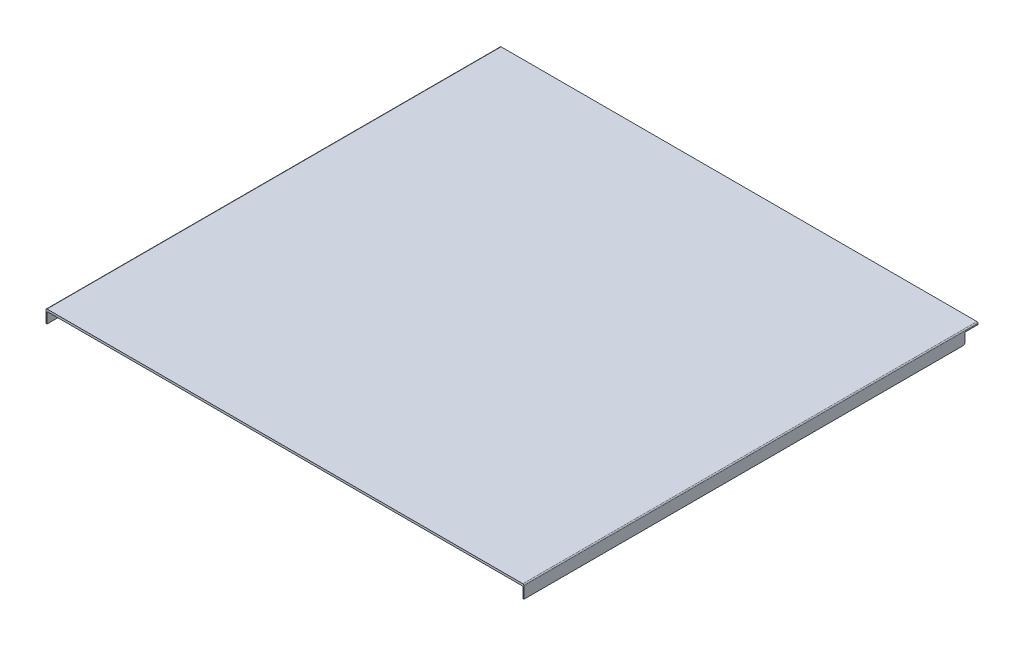
ISO-10303-21;
HEADER;
FILE_DESCRIPTION(('STEP AP214'),'2;1');
FILE_NAME('part.step','',(''),(''),'','','');
FILE_SCHEMA(('AUTOMOTIVE_DESIGN { 1 0 10303 214 1 1 1 1 }'));
ENDSEC;
DATA;
#1=APPLICATION_CONTEXT('core data for automotive mechanical design processes');
#2=APPLICATION_PROTOCOL_DEFINITION('international standard','automotive_design',2000,#1);
#3=PRODUCT_CONTEXT('',#1,'mechanical');
#4=PRODUCT('Part','Part','',(#3));
#5=PRODUCT_RELATED_PRODUCT_CATEGORY('part','',(#4));
#6=PRODUCT_DEFINITION_FORMATION('','',#4);
#7=PRODUCT_DEFINITION_CONTEXT('part definition',#1,'design');
#8=PRODUCT_DEFINITION('design','',#6,#7);
#9=PRODUCT_DEFINITION_SHAPE('','',#8);
#10=(LENGTH_UNIT() NAMED_UNIT(*) SI_UNIT(.MILLI.,.METRE.));
#11=(NAMED_UNIT(*) PLANE_ANGLE_UNIT() SI_UNIT($,.RADIAN.));
#12=(NAMED_UNIT(*) SI_UNIT($,.STERADIAN.) SOLID_ANGLE_UNIT());
#13=UNCERTAINTY_MEASURE_WITH_UNIT(LENGTH_MEASURE(1.E-05),#10,'distance_accuracy_value','');
#14=(GEOMETRIC_REPRESENTATION_CONTEXT(3) GLOBAL_UNCERTAINTY_ASSIGNED_CONTEXT((#13)) GLOBAL_UNIT_ASSIGNED_CONTEXT((#10,
#11,#12)) REPRESENTATION_CONTEXT('',''));
#15=CARTESIAN_POINT('',(0.,0.,0.));
#16=DIRECTION('',(0.,0.,1.));
#17=DIRECTION('',(1.,0.,0.));
#18=AXIS2_PLACEMENT_3D('',#15,#16,#17);
#19=CARTESIAN_POINT('',(0.,0.,0.));
#20=DIRECTION('',(0.,-1.,0.));
#21=DIRECTION('',(0.,0.,-1.));
#22=AXIS2_PLACEMENT_3D('',#19,#20,#21);
#23=PLANE('',#22);
#24=DIRECTION('',(1.,0.,0.));
#25=VECTOR('',#24,1.);
#26=CARTESIAN_POINT('',(-221.,0.,210.));
#27=LINE('',#26,#25);
#28=CARTESIAN_POINT('',(-219.5,0.,210.));
#29=VERTEX_POINT('',#28);
#30=CARTESIAN_POINT('',(219.5,0.,210.));
#31=VERTEX_POINT('',#30);
#32=EDGE_CURVE('E201',#29,#31,#27,.T.);
#33=ORIENTED_EDGE('',*,*,#32,.F.);
#34=DIRECTION('',(0.,0.,1.));
#35=VECTOR('',#34,1.);
#36=CARTESIAN_POINT('',(-219.5,0.,0.));
#37=LINE('',#36,#35);
#38=CARTESIAN_POINT('',(-219.5,0.,-198.5));
#39=VERTEX_POINT('',#38);
#40=EDGE_CURVE('E273',#29,#39,#37,.F.);
#41=ORIENTED_EDGE('',*,*,#40,.T.);
#42=DIRECTION('',(1.,0.,0.));
#43=VECTOR('',#42,1.);
#44=CARTESIAN_POINT('',(0.,0.,-198.5));
#45=LINE('',#44,#43);
#46=CARTESIAN_POINT('',(-221.,0.,-198.5));
#47=VERTEX_POINT('',#46);
#48=EDGE_CURVE('E53',#39,#47,#45,.F.);
#49=ORIENTED_EDGE('',*,*,#48,.T.);
#50=DIRECTION('',(0.,0.,1.));
#51=VECTOR('',#50,1.);
#52=CARTESIAN_POINT('',(-221.,0.,210.));
#53=LINE('',#52,#51);
#54=CARTESIAN_POINT('',(-221.,0.,-210.));
#55=VERTEX_POINT('',#54);
#56=EDGE_CURVE('E210',#55,#47,#53,.T.);
#57=ORIENTED_EDGE('',*,*,#56,.F.);
#58=DIRECTION('',(-1.,0.,0.));
#59=VECTOR('',#58,1.);
#60=CARTESIAN_POINT('',(-221.,0.,-210.));
#61=LINE('',#60,#59);
#62=CARTESIAN_POINT('',(221.,0.,-210.));
#63=VERTEX_POINT('',#62);
#64=EDGE_CURVE('E207',#63,#55,#61,.T.);
#65=ORIENTED_EDGE('',*,*,#64,.F.);
#66=DIRECTION('',(0.,0.,-1.));
#67=VECTOR('',#66,1.);
#68=CARTESIAN_POINT('',(221.,0.,210.));
#69=LINE('',#68,#67);
#70=CARTESIAN_POINT('',(221.,0.,-198.5));
#71=VERTEX_POINT('',#70);
#72=EDGE_CURVE('E196',#71,#63,#69,.T.);
#73=ORIENTED_EDGE('',*,*,#72,.F.);
#74=DIRECTION('',(1.,0.,0.));
#75=VECTOR('',#74,1.);
#76=CARTESIAN_POINT('',(0.,0.,-198.5));
#77=LINE('',#76,#75);
#78=CARTESIAN_POINT('',(219.5,0.,-198.5));
#79=VERTEX_POINT('',#78);
#80=EDGE_CURVE('E241',#71,#79,#77,.F.);
#81=ORIENTED_EDGE('',*,*,#80,.T.);
#82=DIRECTION('',(0.,0.,-1.));
#83=VECTOR('',#82,1.);
#84=CARTESIAN_POINT('',(219.5,0.,0.));
#85=LINE('',#84,#83);
#86=EDGE_CURVE('E271',#79,#31,#85,.F.);
#87=ORIENTED_EDGE('',*,*,#86,.T.);
#88=EDGE_LOOP('',(#33,#41,#49,#57,#65,#73,#81,#87));
#89=FACE_BOUND('',#88,.T.);
#90=ADVANCED_FACE('F32',(#89),#23,.T.);
#91=CARTESIAN_POINT('',(221.,2.,210.));
#92=DIRECTION('',(-1.,0.,0.));
#93=DIRECTION('',(0.,0.,1.));
#94=AXIS2_PLACEMENT_3D('',#91,#92,#93);
#95=PLANE('',#94);
#96=DIRECTION('',(0.,-1.,0.));
#97=VECTOR('',#96,1.);
#98=CARTESIAN_POINT('',(221.,2.,-210.));
#99=LINE('',#98,#97);
#100=CARTESIAN_POINT('',(221.,1.,-210.));
#101=VERTEX_POINT('',#100);
#102=EDGE_CURVE('E219',#101,#63,#99,.T.);
#103=ORIENTED_EDGE('',*,*,#102,.F.);
#104=DIRECTION('',(0.,0.,-1.));
#105=VECTOR('',#104,1.);
#106=CARTESIAN_POINT('',(221.,1.,210.));
#107=LINE('',#106,#105);
#108=CARTESIAN_POINT('',(221.,1.,210.));
#109=VERTEX_POINT('',#108);
#110=EDGE_CURVE('E260',#101,#109,#107,.F.);
#111=ORIENTED_EDGE('',*,*,#110,.T.);
#112=DIRECTION('',(0.,-1.,0.));
#113=VECTOR('',#112,1.);
#114=CARTESIAN_POINT('',(221.,2.,210.));
#115=LINE('',#114,#113);
#116=CARTESIAN_POINT('',(221.,-10.,210.));
#117=VERTEX_POINT('',#116);
#118=EDGE_CURVE('E204',#109,#117,#115,.T.);
#119=ORIENTED_EDGE('',*,*,#118,.T.);
#120=DIRECTION('',(0.,0.,1.));
#121=VECTOR('',#120,1.);
#122=CARTESIAN_POINT('',(221.,-10.,210.));
#123=LINE('',#122,#121);
#124=CARTESIAN_POINT('',(221.,-10.,-196.));
#125=VERTEX_POINT('',#124);
#126=EDGE_CURVE('E162',#125,#117,#123,.T.);
#127=ORIENTED_EDGE('',*,*,#126,.F.);
#128=CARTESIAN_POINT('',(221.,-8.,-196.));
#129=DIRECTION('',(-1.,0.,0.));
#130=DIRECTION('',(0.,0.,1.));
#131=AXIS2_PLACEMENT_3D('',#128,#129,#130);
#132=CIRCLE('',#131,2.);
#133=CARTESIAN_POINT('',(221.,-8.,-198.));
#134=VERTEX_POINT('',#133);
#135=EDGE_CURVE('E223',#125,#134,#132,.F.);
#136=ORIENTED_EDGE('',*,*,#135,.T.);
#137=DIRECTION('',(0.,1.,0.));
#138=VECTOR('',#137,1.);
#139=CARTESIAN_POINT('',(221.,-10.,-198.));
#140=LINE('',#139,#138);
#141=CARTESIAN_POINT('',(221.,-0.5,-198.));
#142=VERTEX_POINT('',#141);
#143=EDGE_CURVE('E179',#134,#142,#140,.T.);
#144=ORIENTED_EDGE('',*,*,#143,.T.);
#145=CARTESIAN_POINT('',(221.,-0.5,-198.5));
#146=DIRECTION('',(-1.,0.,0.));
#147=DIRECTION('',(0.,0.,1.));
#148=AXIS2_PLACEMENT_3D('',#145,#146,#147);
#149=CIRCLE('',#148,0.5);
#150=EDGE_CURVE('E246',#142,#71,#149,.T.);
#151=ORIENTED_EDGE('',*,*,#150,.T.);
#152=ORIENTED_EDGE('',*,*,#72,.T.);
#153=EDGE_LOOP('',(#103,#111,#119,#127,#136,#144,#151,#152));
#154=FACE_BOUND('',#153,.T.);
#155=ADVANCED_FACE('F335',(#154),#95,.F.);
#156=CARTESIAN_POINT('',(-221.,2.,-210.));
#157=DIRECTION('',(0.,0.,1.));
#158=DIRECTION('',(1.,0.,0.));
#159=AXIS2_PLACEMENT_3D('',#156,#157,#158);
#160=PLANE('',#159);
#161=DIRECTION('',(-1.,0.,0.));
#162=VECTOR('',#161,1.);
#163=CARTESIAN_POINT('',(-221.,2.,-210.));
#164=LINE('',#163,#162);
#165=CARTESIAN_POINT('',(220.,2.,-210.));
#166=VERTEX_POINT('',#165);
#167=CARTESIAN_POINT('',(-220.,2.,-210.));
#168=VERTEX_POINT('',#167);
#169=EDGE_CURVE('E197',#166,#168,#164,.T.);
#170=ORIENTED_EDGE('',*,*,#169,.F.);
#171=CARTESIAN_POINT('',(220.,1.,-210.));
#172=DIRECTION('',(0.,0.,1.));
#173=DIRECTION('',(1.,0.,0.));
#174=AXIS2_PLACEMENT_3D('',#171,#172,#173);
#175=CIRCLE('',#174,1.);
#176=EDGE_CURVE('E258',#166,#101,#175,.F.);
#177=ORIENTED_EDGE('',*,*,#176,.T.);
#178=ORIENTED_EDGE('',*,*,#102,.T.);
#179=ORIENTED_EDGE('',*,*,#64,.T.);
#180=DIRECTION('',(0.,-1.,0.));
#181=VECTOR('',#180,1.);
#182=CARTESIAN_POINT('',(-221.,2.,-210.));
#183=LINE('',#182,#181);
#184=CARTESIAN_POINT('',(-221.,1.,-210.));
#185=VERTEX_POINT('',#184);
#186=EDGE_CURVE('E217',#185,#55,#183,.T.);
#187=ORIENTED_EDGE('',*,*,#186,.F.);
#188=CARTESIAN_POINT('',(-220.,1.,-210.));
#189=DIRECTION('',(0.,0.,1.));
#190=DIRECTION('',(1.,0.,0.));
#191=AXIS2_PLACEMENT_3D('',#188,#189,#190);
#192=CIRCLE('',#191,1.);
#193=EDGE_CURVE('E256',#185,#168,#192,.F.);
#194=ORIENTED_EDGE('',*,*,#193,.T.);
#195=EDGE_LOOP('',(#170,#177,#178,#179,#187,#194));
#196=FACE_BOUND('',#195,.T.);
#197=ADVANCED_FACE('F325',(#196),#160,.F.);
#198=CARTESIAN_POINT('',(-221.,2.,210.));
#199=DIRECTION('',(1.,0.,0.));
#200=DIRECTION('',(0.,0.,-1.));
#201=AXIS2_PLACEMENT_3D('',#198,#199,#200);
#202=PLANE('',#201);
#203=DIRECTION('',(0.,-1.,0.));
#204=VECTOR('',#203,1.);
#205=CARTESIAN_POINT('',(-221.,2.,210.));
#206=LINE('',#205,#204);
#207=CARTESIAN_POINT('',(-221.,1.,210.));
#208=VERTEX_POINT('',#207);
#209=CARTESIAN_POINT('',(-221.,-10.,210.));
#210=VERTEX_POINT('',#209);
#211=EDGE_CURVE('E215',#208,#210,#206,.T.);
#212=ORIENTED_EDGE('',*,*,#211,.F.);
#213=DIRECTION('',(0.,0.,1.));
#214=VECTOR('',#213,1.);
#215=CARTESIAN_POINT('',(-221.,1.,210.));
#216=LINE('',#215,#214);
#217=EDGE_CURVE('E266',#208,#185,#216,.F.);
#218=ORIENTED_EDGE('',*,*,#217,.T.);
#219=ORIENTED_EDGE('',*,*,#186,.T.);
#220=ORIENTED_EDGE('',*,*,#56,.T.);
#221=CARTESIAN_POINT('',(-221.,-0.5,-198.5));
#222=DIRECTION('',(1.,0.,0.));
#223=DIRECTION('',(0.,0.,-1.));
#224=AXIS2_PLACEMENT_3D('',#221,#222,#223);
#225=CIRCLE('',#224,0.5);
#226=CARTESIAN_POINT('',(-221.,-0.5,-198.));
#227=VERTEX_POINT('',#226);
#228=EDGE_CURVE('E248',#47,#227,#225,.T.);
#229=ORIENTED_EDGE('',*,*,#228,.T.);
#230=DIRECTION('',(0.,1.,0.));
#231=VECTOR('',#230,1.);
#232=CARTESIAN_POINT('',(-221.,-10.,-198.));
#233=LINE('',#232,#231);
#234=CARTESIAN_POINT('',(-221.,-8.,-198.));
#235=VERTEX_POINT('',#234);
#236=EDGE_CURVE('E193',#235,#227,#233,.T.);
#237=ORIENTED_EDGE('',*,*,#236,.F.);
#238=CARTESIAN_POINT('',(-221.,-8.,-196.));
#239=DIRECTION('',(1.,0.,0.));
#240=DIRECTION('',(0.,0.,-1.));
#241=AXIS2_PLACEMENT_3D('',#238,#239,#240);
#242=CIRCLE('',#241,2.);
#243=CARTESIAN_POINT('',(-221.,-10.,-196.));
#244=VERTEX_POINT('',#243);
#245=EDGE_CURVE('E235',#235,#244,#242,.F.);
#246=ORIENTED_EDGE('',*,*,#245,.T.);
#247=DIRECTION('',(0.,0.,-1.));
#248=VECTOR('',#247,1.);
#249=CARTESIAN_POINT('',(-221.,-10.,210.));
#250=LINE('',#249,#248);
#251=EDGE_CURVE('E172',#210,#244,#250,.T.);
#252=ORIENTED_EDGE('',*,*,#251,.F.);
#253=EDGE_LOOP('',(#212,#218,#219,#220,#229,#237,#246,#252));
#254=FACE_BOUND('',#253,.T.);
#255=ADVANCED_FACE('F313',(#254),#202,.F.);
#256=CARTESIAN_POINT('',(-221.,2.,210.));
#257=DIRECTION('',(0.,0.,-1.));
#258=DIRECTION('',(-1.,0.,0.));
#259=AXIS2_PLACEMENT_3D('',#256,#257,#258);
#260=PLANE('',#259);
#261=ORIENTED_EDGE('',*,*,#118,.F.);
#262=CARTESIAN_POINT('',(220.,1.,210.));
#263=DIRECTION('',(0.,0.,-1.));
#264=DIRECTION('',(-1.,0.,0.));
#265=AXIS2_PLACEMENT_3D('',#262,#263,#264);
#266=CIRCLE('',#265,1.);
#267=CARTESIAN_POINT('',(220.,2.,210.));
#268=VERTEX_POINT('',#267);
#269=EDGE_CURVE('E264',#109,#268,#266,.F.);
#270=ORIENTED_EDGE('',*,*,#269,.T.);
#271=DIRECTION('',(1.,0.,0.));
#272=VECTOR('',#271,1.);
#273=CARTESIAN_POINT('',(-221.,2.,210.));
#274=LINE('',#273,#272);
#275=CARTESIAN_POINT('',(-220.,2.,210.));
#276=VERTEX_POINT('',#275);
#277=EDGE_CURVE('E200',#276,#268,#274,.T.);
#278=ORIENTED_EDGE('',*,*,#277,.F.);
#279=CARTESIAN_POINT('',(-220.,1.,210.));
#280=DIRECTION('',(0.,0.,-1.));
#281=DIRECTION('',(-1.,0.,0.));
#282=AXIS2_PLACEMENT_3D('',#279,#280,#281);
#283=CIRCLE('',#282,1.);
#284=EDGE_CURVE('E262',#276,#208,#283,.F.);
#285=ORIENTED_EDGE('',*,*,#284,.T.);
#286=ORIENTED_EDGE('',*,*,#211,.T.);
#287=DIRECTION('',(-1.,0.,0.));
#288=VECTOR('',#287,1.);
#289=CARTESIAN_POINT('',(-221.,-10.,210.));
#290=LINE('',#289,#288);
#291=CARTESIAN_POINT('',(-220.,-10.,210.));
#292=VERTEX_POINT('',#291);
#293=EDGE_CURVE('E184',#292,#210,#290,.T.);
#294=ORIENTED_EDGE('',*,*,#293,.F.);
#295=DIRECTION('',(0.,1.,0.));
#296=VECTOR('',#295,1.);
#297=CARTESIAN_POINT('',(-220.,-10.,210.));
#298=LINE('',#297,#296);
#299=CARTESIAN_POINT('',(-220.,-0.5,210.));
#300=VERTEX_POINT('',#299);
#301=EDGE_CURVE('E187',#292,#300,#298,.T.);
#302=ORIENTED_EDGE('',*,*,#301,.T.);
#303=CARTESIAN_POINT('',(-219.5,-0.5,210.));
#304=DIRECTION('',(0.,0.,-1.));
#305=DIRECTION('',(-1.,0.,0.));
#306=AXIS2_PLACEMENT_3D('',#303,#304,#305);
#307=CIRCLE('',#306,0.5);
#308=EDGE_CURVE('E277',#300,#29,#307,.T.);
#309=ORIENTED_EDGE('',*,*,#308,.T.);
#310=ORIENTED_EDGE('',*,*,#32,.T.);
#311=CARTESIAN_POINT('',(219.5,-0.5,210.));
#312=DIRECTION('',(0.,0.,-1.));
#313=DIRECTION('',(-1.,0.,0.));
#314=AXIS2_PLACEMENT_3D('',#311,#312,#313);
#315=CIRCLE('',#314,0.5);
#316=CARTESIAN_POINT('',(220.,-0.5,210.));
#317=VERTEX_POINT('',#316);
#318=EDGE_CURVE('E11',#31,#317,#315,.T.);
#319=ORIENTED_EDGE('',*,*,#318,.T.);
#320=DIRECTION('',(0.,1.,0.));
#321=VECTOR('',#320,1.);
#322=CARTESIAN_POINT('',(220.,-10.,210.));
#323=LINE('',#322,#321);
#324=CARTESIAN_POINT('',(220.,-10.,210.));
#325=VERTEX_POINT('',#324);
#326=EDGE_CURVE('E154',#325,#317,#323,.T.);
#327=ORIENTED_EDGE('',*,*,#326,.F.);
#328=DIRECTION('',(-1.,0.,-1.11022302462528E-13));
#329=VECTOR('',#328,1.);
#330=CARTESIAN_POINT('',(221.,-10.,210.));
#331=LINE('',#330,#329);
#332=EDGE_CURVE('E163',#117,#325,#331,.T.);
#333=ORIENTED_EDGE('',*,*,#332,.F.);
#334=EDGE_LOOP('',(#261,#270,#278,#285,#286,#294,#302,#309,#310,#319,#327,#333));
#335=FACE_BOUND('',#334,.T.);
#336=ADVANCED_FACE('F171',(#335),#260,.F.);
#337=CARTESIAN_POINT('',(0.,2.,0.));
#338=DIRECTION('',(0.,-1.,0.));
#339=DIRECTION('',(0.,0.,-1.));
#340=AXIS2_PLACEMENT_3D('',#337,#338,#339);
#341=PLANE('',#340);
#342=ORIENTED_EDGE('',*,*,#277,.T.);
#343=DIRECTION('',(0.,0.,-1.));
#344=VECTOR('',#343,1.);
#345=CARTESIAN_POINT('',(220.,2.,0.));
#346=LINE('',#345,#344);
#347=EDGE_CURVE('E253',#268,#166,#346,.T.);
#348=ORIENTED_EDGE('',*,*,#347,.T.);
#349=ORIENTED_EDGE('',*,*,#169,.T.);
#350=DIRECTION('',(0.,0.,1.));
#351=VECTOR('',#350,1.);
#352=CARTESIAN_POINT('',(-220.,2.,0.));
#353=LINE('',#352,#351);
#354=EDGE_CURVE('E250',#168,#276,#353,.T.);
#355=ORIENTED_EDGE('',*,*,#354,.T.);
#356=EDGE_LOOP('',(#342,#348,#349,#355));
#357=FACE_BOUND('',#356,.T.);
#358=ADVANCED_FACE('F327',(#357),#341,.F.);
#359=CARTESIAN_POINT('',(-221.,-10.,-198.));
#360=DIRECTION('',(0.,0.,1.));
#361=DIRECTION('',(1.,0.,0.));
#362=AXIS2_PLACEMENT_3D('',#359,#360,#361);
#363=PLANE('',#362);
#364=ORIENTED_EDGE('',*,*,#236,.T.);
#365=DIRECTION('',(1.,0.,0.));
#366=VECTOR('',#365,1.);
#367=CARTESIAN_POINT('',(-221.,-0.5,-198.));
#368=LINE('',#367,#366);
#369=CARTESIAN_POINT('',(-220.,-0.5,-198.));
#370=VERTEX_POINT('',#369);
#371=EDGE_CURVE('E243',#227,#370,#368,.T.);
#372=ORIENTED_EDGE('',*,*,#371,.T.);
#373=DIRECTION('',(0.,1.,0.));
#374=VECTOR('',#373,1.);
#375=CARTESIAN_POINT('',(-220.,-10.,-198.));
#376=LINE('',#375,#374);
#377=CARTESIAN_POINT('',(-220.,-8.,-198.));
#378=VERTEX_POINT('',#377);
#379=EDGE_CURVE('E190',#378,#370,#376,.T.);
#380=ORIENTED_EDGE('',*,*,#379,.F.);
#381=DIRECTION('',(1.,0.,0.));
#382=VECTOR('',#381,1.);
#383=CARTESIAN_POINT('',(-221.,-8.,-198.));
#384=LINE('',#383,#382);
#385=EDGE_CURVE('E233',#378,#235,#384,.F.);
#386=ORIENTED_EDGE('',*,*,#385,.T.);
#387=EDGE_LOOP('',(#364,#372,#380,#386));
#388=FACE_BOUND('',#387,.T.);
#389=ADVANCED_FACE('F303',(#388),#363,.F.);
#390=CARTESIAN_POINT('',(-220.,-10.,210.));
#391=DIRECTION('',(-1.,0.,0.));
#392=DIRECTION('',(0.,0.,1.));
#393=AXIS2_PLACEMENT_3D('',#390,#391,#392);
#394=PLANE('',#393);
#395=ORIENTED_EDGE('',*,*,#379,.T.);
#396=DIRECTION('',(0.,0.,1.));
#397=VECTOR('',#396,1.);
#398=CARTESIAN_POINT('',(-220.,-0.5,210.));
#399=LINE('',#398,#397);
#400=EDGE_CURVE('E268',#370,#300,#399,.T.);
#401=ORIENTED_EDGE('',*,*,#400,.T.);
#402=ORIENTED_EDGE('',*,*,#301,.F.);
#403=DIRECTION('',(0.,0.,1.));
#404=VECTOR('',#403,1.);
#405=CARTESIAN_POINT('',(-220.,-10.,210.));
#406=LINE('',#405,#404);
#407=CARTESIAN_POINT('',(-220.,-10.,-196.));
#408=VERTEX_POINT('',#407);
#409=EDGE_CURVE('E176',#408,#292,#406,.T.);
#410=ORIENTED_EDGE('',*,*,#409,.F.);
#411=CARTESIAN_POINT('',(-220.,-8.,-196.));
#412=DIRECTION('',(-1.,0.,0.));
#413=DIRECTION('',(0.,0.,1.));
#414=AXIS2_PLACEMENT_3D('',#411,#412,#413);
#415=CIRCLE('',#414,2.);
#416=EDGE_CURVE('E231',#408,#378,#415,.F.);
#417=ORIENTED_EDGE('',*,*,#416,.T.);
#418=EDGE_LOOP('',(#395,#401,#402,#410,#417));
#419=FACE_BOUND('',#418,.T.);
#420=ADVANCED_FACE('F298',(#419),#394,.F.);
#421=CARTESIAN_POINT('',(0.,-10.,0.));
#422=DIRECTION('',(0.,-1.,0.));
#423=DIRECTION('',(0.,0.,-1.));
#424=AXIS2_PLACEMENT_3D('',#421,#422,#423);
#425=PLANE('',#424);
#426=ORIENTED_EDGE('',*,*,#251,.T.);
#427=DIRECTION('',(1.,0.,0.));
#428=VECTOR('',#427,1.);
#429=CARTESIAN_POINT('',(-220.,-10.,-196.));
#430=LINE('',#429,#428);
#431=EDGE_CURVE('E228',#244,#408,#430,.T.);
#432=ORIENTED_EDGE('',*,*,#431,.T.);
#433=ORIENTED_EDGE('',*,*,#409,.T.);
#434=ORIENTED_EDGE('',*,*,#293,.T.);
#435=EDGE_LOOP('',(#426,#432,#433,#434));
#436=FACE_BOUND('',#435,.T.);
#437=ADVANCED_FACE('F315',(#436),#425,.T.);
#438=CARTESIAN_POINT('',(220.,-10.,210.));
#439=DIRECTION('',(1.,0.,0.));
#440=DIRECTION('',(0.,0.,-1.));
#441=AXIS2_PLACEMENT_3D('',#438,#439,#440);
#442=PLANE('',#441);
#443=ORIENTED_EDGE('',*,*,#326,.T.);
#444=DIRECTION('',(0.,0.,-1.));
#445=VECTOR('',#444,1.);
#446=CARTESIAN_POINT('',(220.,-0.5,210.));
#447=LINE('',#446,#445);
#448=CARTESIAN_POINT('',(220.,-0.5,-198.));
#449=VERTEX_POINT('',#448);
#450=EDGE_CURVE('E275',#317,#449,#447,.T.);
#451=ORIENTED_EDGE('',*,*,#450,.T.);
#452=DIRECTION('',(0.,1.,0.));
#453=VECTOR('',#452,1.);
#454=CARTESIAN_POINT('',(220.,-10.,-198.));
#455=LINE('',#454,#453);
#456=CARTESIAN_POINT('',(220.,-8.,-198.));
#457=VERTEX_POINT('',#456);
#458=EDGE_CURVE('E173',#457,#449,#455,.T.);
#459=ORIENTED_EDGE('',*,*,#458,.F.);
#460=CARTESIAN_POINT('',(220.,-8.,-196.));
#461=DIRECTION('',(1.,0.,0.));
#462=DIRECTION('',(0.,0.,-1.));
#463=AXIS2_PLACEMENT_3D('',#460,#461,#462);
#464=CIRCLE('',#463,2.);
#465=CARTESIAN_POINT('',(220.,-10.,-196.));
#466=VERTEX_POINT('',#465);
#467=EDGE_CURVE('E158',#457,#466,#464,.F.);
#468=ORIENTED_EDGE('',*,*,#467,.T.);
#469=DIRECTION('',(0.,0.,-1.));
#470=VECTOR('',#469,1.);
#471=CARTESIAN_POINT('',(220.,-10.,210.));
#472=LINE('',#471,#470);
#473=EDGE_CURVE('E150',#325,#466,#472,.T.);
#474=ORIENTED_EDGE('',*,*,#473,.F.);
#475=EDGE_LOOP('',(#443,#451,#459,#468,#474));
#476=FACE_BOUND('',#475,.T.);
#477=ADVANCED_FACE('F152',(#476),#442,.F.);
#478=CARTESIAN_POINT('',(221.,-10.,-198.));
#479=DIRECTION('',(0.,0.,1.));
#480=DIRECTION('',(1.,0.,0.));
#481=AXIS2_PLACEMENT_3D('',#478,#479,#480);
#482=PLANE('',#481);
#483=ORIENTED_EDGE('',*,*,#458,.T.);
#484=DIRECTION('',(1.,0.,0.));
#485=VECTOR('',#484,1.);
#486=CARTESIAN_POINT('',(221.,-0.5,-198.));
#487=LINE('',#486,#485);
#488=EDGE_CURVE('E237',#449,#142,#487,.T.);
#489=ORIENTED_EDGE('',*,*,#488,.T.);
#490=ORIENTED_EDGE('',*,*,#143,.F.);
#491=DIRECTION('',(1.,0.,0.));
#492=VECTOR('',#491,1.);
#493=CARTESIAN_POINT('',(220.,-8.,-198.));
#494=LINE('',#493,#492);
#495=EDGE_CURVE('E225',#134,#457,#494,.F.);
#496=ORIENTED_EDGE('',*,*,#495,.T.);
#497=EDGE_LOOP('',(#483,#489,#490,#496));
#498=FACE_BOUND('',#497,.T.);
#499=ADVANCED_FACE('F384',(#498),#482,.F.);
#500=CARTESIAN_POINT('',(0.,-10.,0.));
#501=DIRECTION('',(0.,-1.,0.));
#502=DIRECTION('',(0.,0.,-1.));
#503=AXIS2_PLACEMENT_3D('',#500,#501,#502);
#504=PLANE('',#503);
#505=ORIENTED_EDGE('',*,*,#473,.T.);
#506=DIRECTION('',(1.,0.,0.));
#507=VECTOR('',#506,1.);
#508=CARTESIAN_POINT('',(221.,-10.,-196.));
#509=LINE('',#508,#507);
#510=EDGE_CURVE('E221',#466,#125,#509,.T.);
#511=ORIENTED_EDGE('',*,*,#510,.T.);
#512=ORIENTED_EDGE('',*,*,#126,.T.);
#513=ORIENTED_EDGE('',*,*,#332,.T.);
#514=EDGE_LOOP('',(#505,#511,#512,#513));
#515=FACE_BOUND('',#514,.T.);
#516=ADVANCED_FACE('F167',(#515),#504,.T.);
#517=CARTESIAN_POINT('',(0.,-8.,-196.));
#518=DIRECTION('',(-1.,0.,0.));
#519=DIRECTION('',(0.,0.,1.));
#520=AXIS2_PLACEMENT_3D('',#517,#518,#519);
#521=CYLINDRICAL_SURFACE('',#520,2.);
#522=ORIENTED_EDGE('',*,*,#467,.F.);
#523=ORIENTED_EDGE('',*,*,#495,.F.);
#524=ORIENTED_EDGE('',*,*,#135,.F.);
#525=ORIENTED_EDGE('',*,*,#510,.F.);
#526=EDGE_LOOP('',(#522,#523,#524,#525));
#527=FACE_BOUND('',#526,.T.);
#528=ADVANCED_FACE('F363',(#527),#521,.T.);
#529=CARTESIAN_POINT('',(0.,-8.,-196.));
#530=DIRECTION('',(-1.,0.,0.));
#531=DIRECTION('',(0.,0.,1.));
#532=AXIS2_PLACEMENT_3D('',#529,#530,#531);
#533=CYLINDRICAL_SURFACE('',#532,2.);
#534=ORIENTED_EDGE('',*,*,#245,.F.);
#535=ORIENTED_EDGE('',*,*,#385,.F.);
#536=ORIENTED_EDGE('',*,*,#416,.F.);
#537=ORIENTED_EDGE('',*,*,#431,.F.);
#538=EDGE_LOOP('',(#534,#535,#536,#537));
#539=FACE_BOUND('',#538,.T.);
#540=ADVANCED_FACE('F308',(#539),#533,.T.);
#541=CARTESIAN_POINT('',(221.,-0.5,-198.5));
#542=DIRECTION('',(1.,0.,0.));
#543=DIRECTION('',(0.,0.,-1.));
#544=AXIS2_PLACEMENT_3D('',#541,#542,#543);
#545=CYLINDRICAL_SURFACE('',#544,0.5);
#546=ORIENTED_EDGE('',*,*,#488,.F.);
#547=CARTESIAN_POINT('',(219.5,-0.5,-198.5));
#548=DIRECTION('',(0.707106781186547,0.,-0.707106781186548));
#549=DIRECTION('',(0.707106781186548,0.,0.707106781186547));
#550=AXIS2_PLACEMENT_3D('',#547,#548,#549);
#551=ELLIPSE('',#550,0.707106781186548,0.5);
#552=EDGE_CURVE('E40',#449,#79,#551,.F.);
#553=ORIENTED_EDGE('',*,*,#552,.T.);
#554=ORIENTED_EDGE('',*,*,#80,.F.);
#555=ORIENTED_EDGE('',*,*,#150,.F.);
#556=EDGE_LOOP('',(#546,#553,#554,#555));
#557=FACE_BOUND('',#556,.T.);
#558=ADVANCED_FACE('F285',(#557),#545,.F.);
#559=CARTESIAN_POINT('',(-221.,-0.5,-198.5));
#560=DIRECTION('',(1.,0.,0.));
#561=DIRECTION('',(0.,0.,-1.));
#562=AXIS2_PLACEMENT_3D('',#559,#560,#561);
#563=CYLINDRICAL_SURFACE('',#562,0.5);
#564=ORIENTED_EDGE('',*,*,#228,.F.);
#565=ORIENTED_EDGE('',*,*,#48,.F.);
#566=CARTESIAN_POINT('',(-219.5,-0.5,-198.5));
#567=DIRECTION('',(0.707106781186547,0.,0.707106781186548));
#568=DIRECTION('',(0.707106781186548,0.,-0.707106781186547));
#569=AXIS2_PLACEMENT_3D('',#566,#567,#568);
#570=ELLIPSE('',#569,0.707106781186548,0.5);
#571=EDGE_CURVE('E279',#39,#370,#570,.T.);
#572=ORIENTED_EDGE('',*,*,#571,.T.);
#573=ORIENTED_EDGE('',*,*,#371,.F.);
#574=EDGE_LOOP('',(#564,#565,#572,#573));
#575=FACE_BOUND('',#574,.T.);
#576=ADVANCED_FACE('F339',(#575),#563,.F.);
#577=CARTESIAN_POINT('',(220.,1.,0.));
#578=DIRECTION('',(0.,0.,-1.));
#579=DIRECTION('',(-1.,0.,0.));
#580=AXIS2_PLACEMENT_3D('',#577,#578,#579);
#581=CYLINDRICAL_SURFACE('',#580,1.);
#582=ORIENTED_EDGE('',*,*,#269,.F.);
#583=ORIENTED_EDGE('',*,*,#110,.F.);
#584=ORIENTED_EDGE('',*,*,#176,.F.);
#585=ORIENTED_EDGE('',*,*,#347,.F.);
#586=EDGE_LOOP('',(#582,#583,#584,#585));
#587=FACE_BOUND('',#586,.T.);
#588=ADVANCED_FACE('F331',(#587),#581,.T.);
#589=CARTESIAN_POINT('',(-220.,1.,0.));
#590=DIRECTION('',(0.,0.,1.));
#591=DIRECTION('',(1.,0.,0.));
#592=AXIS2_PLACEMENT_3D('',#589,#590,#591);
#593=CYLINDRICAL_SURFACE('',#592,1.);
#594=ORIENTED_EDGE('',*,*,#193,.F.);
#595=ORIENTED_EDGE('',*,*,#217,.F.);
#596=ORIENTED_EDGE('',*,*,#284,.F.);
#597=ORIENTED_EDGE('',*,*,#354,.F.);
#598=EDGE_LOOP('',(#594,#595,#596,#597));
#599=FACE_BOUND('',#598,.T.);
#600=ADVANCED_FACE('F321',(#599),#593,.T.);
#601=CARTESIAN_POINT('',(-219.5,-0.5,210.));
#602=DIRECTION('',(0.,0.,1.));
#603=DIRECTION('',(1.,0.,0.));
#604=AXIS2_PLACEMENT_3D('',#601,#602,#603);
#605=CYLINDRICAL_SURFACE('',#604,0.5);
#606=ORIENTED_EDGE('',*,*,#571,.F.);
#607=ORIENTED_EDGE('',*,*,#40,.F.);
#608=ORIENTED_EDGE('',*,*,#308,.F.);
#609=ORIENTED_EDGE('',*,*,#400,.F.);
#610=EDGE_LOOP('',(#606,#607,#608,#609));
#611=FACE_BOUND('',#610,.T.);
#612=ADVANCED_FACE('F296',(#611),#605,.F.);
#613=CARTESIAN_POINT('',(219.5,-0.5,210.));
#614=DIRECTION('',(0.,0.,-1.));
#615=DIRECTION('',(-1.,0.,0.));
#616=AXIS2_PLACEMENT_3D('',#613,#614,#615);
#617=CYLINDRICAL_SURFACE('',#616,0.5);
#618=ORIENTED_EDGE('',*,*,#318,.F.);
#619=ORIENTED_EDGE('',*,*,#86,.F.);
#620=ORIENTED_EDGE('',*,*,#552,.F.);
#621=ORIENTED_EDGE('',*,*,#450,.F.);
#622=EDGE_LOOP('',(#618,#619,#620,#621));
#623=FACE_BOUND('',#622,.T.);
#624=ADVANCED_FACE('F34',(#623),#617,.F.);
#625=CLOSED_SHELL('',(#90,#155,#197,#255,#336,#358,#389,#420,#437,#477,#499,#516,#528,#540,#558,
#576,#588,#600,#612,#624));
#626=MANIFOLD_SOLID_BREP('B2',#625);
#627=ADVANCED_BREP_SHAPE_REPRESENTATION('',(#18,#626),#14);
#628=SHAPE_DEFINITION_REPRESENTATION(#9,#627);
ENDSEC;
END-ISO-10303-21;
